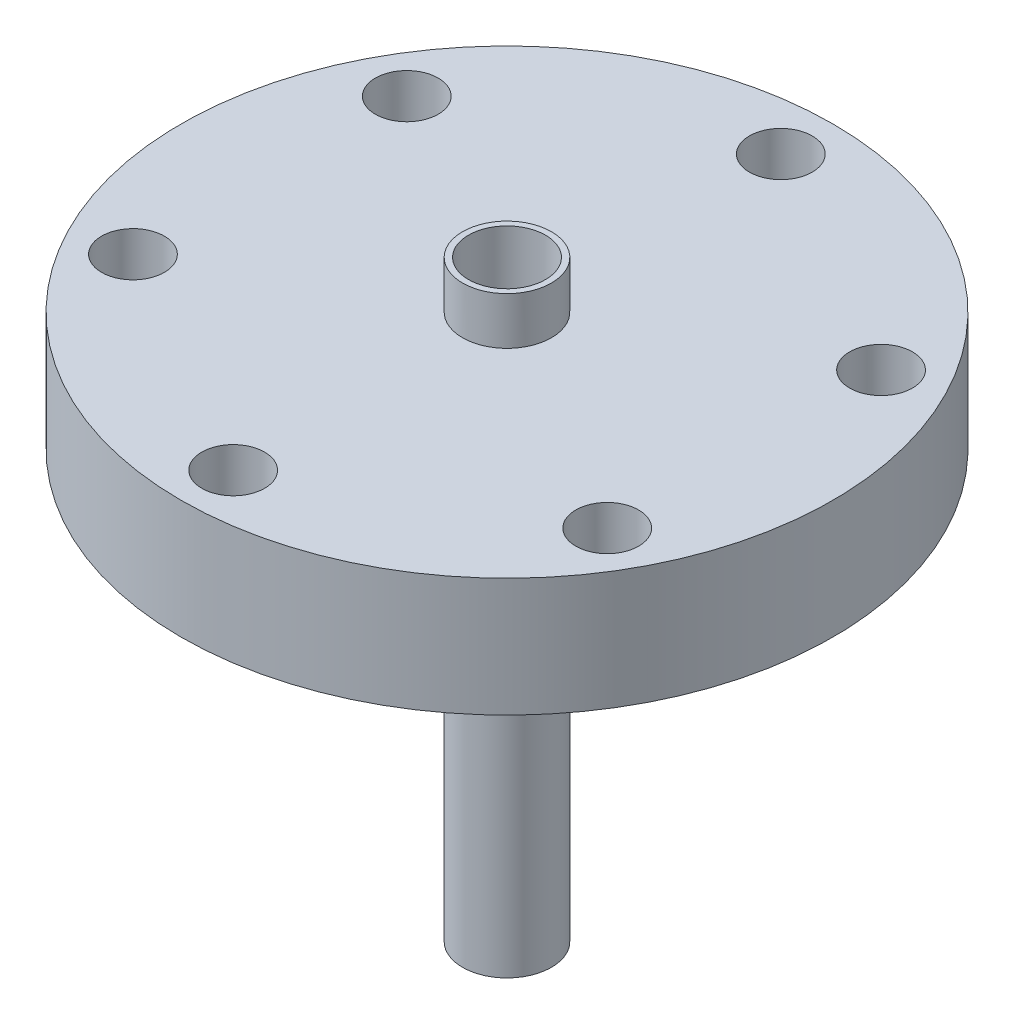
ISO-10303-21;
HEADER;
FILE_DESCRIPTION(('STEP AP214'),'2;1');
FILE_NAME('part.step','',(''),(''),'','','');
FILE_SCHEMA(('AUTOMOTIVE_DESIGN { 1 0 10303 214 1 1 1 1 }'));
ENDSEC;
DATA;
#1=APPLICATION_CONTEXT('core data for automotive mechanical design processes');
#2=APPLICATION_PROTOCOL_DEFINITION('international standard','automotive_design',2000,#1);
#3=PRODUCT_CONTEXT('',#1,'mechanical');
#4=PRODUCT('Part','Part','',(#3));
#5=PRODUCT_RELATED_PRODUCT_CATEGORY('part','',(#4));
#6=PRODUCT_DEFINITION_FORMATION('','',#4);
#7=PRODUCT_DEFINITION_CONTEXT('part definition',#1,'design');
#8=PRODUCT_DEFINITION('design','',#6,#7);
#9=PRODUCT_DEFINITION_SHAPE('','',#8);
#10=(LENGTH_UNIT() NAMED_UNIT(*) SI_UNIT(.MILLI.,.METRE.));
#11=(NAMED_UNIT(*) PLANE_ANGLE_UNIT() SI_UNIT($,.RADIAN.));
#12=(NAMED_UNIT(*) SI_UNIT($,.STERADIAN.) SOLID_ANGLE_UNIT());
#13=UNCERTAINTY_MEASURE_WITH_UNIT(LENGTH_MEASURE(1.E-05),#10,'distance_accuracy_value','');
#14=(GEOMETRIC_REPRESENTATION_CONTEXT(3) GLOBAL_UNCERTAINTY_ASSIGNED_CONTEXT((#13)) GLOBAL_UNIT_ASSIGNED_CONTEXT((#10,
#11,#12)) REPRESENTATION_CONTEXT('',''));
#15=CARTESIAN_POINT('',(0.,0.,0.));
#16=DIRECTION('',(0.,0.,1.));
#17=DIRECTION('',(1.,0.,0.));
#18=AXIS2_PLACEMENT_3D('',#15,#16,#17);
#19=CARTESIAN_POINT('',(0.,12.7,0.));
#20=DIRECTION('',(0.,1.,0.));
#21=DIRECTION('',(0.,0.,1.));
#22=AXIS2_PLACEMENT_3D('',#19,#20,#21);
#23=PLANE('',#22);
#24=CARTESIAN_POINT('',(25.4065872708242,12.7,14.6684999999998));
#25=DIRECTION('',(0.,1.,0.));
#26=DIRECTION('',(-0.866025403784443,0.,-0.499999999999992));
#27=AXIS2_PLACEMENT_3D('',#24,#25,#26);
#28=CIRCLE('',#27,3.3655);
#29=CARTESIAN_POINT('',(22.4919787743877,12.7,12.9857499999998));
#30=VERTEX_POINT('',#29);
#31=EDGE_CURVE('E77',#30,#30,#28,.T.);
#32=ORIENTED_EDGE('',*,*,#31,.F.);
#33=EDGE_LOOP('',(#32));
#34=FACE_BOUND('',#33,.T.);
#35=CARTESIAN_POINT('',(-25.406587270824,12.7,14.6685000000001));
#36=DIRECTION('',(0.,1.,0.));
#37=DIRECTION('',(0.866025403784436,0.,-0.500000000000004));
#38=AXIS2_PLACEMENT_3D('',#35,#36,#37);
#39=CIRCLE('',#38,3.3655);
#40=CARTESIAN_POINT('',(-22.4919787743875,12.7,12.9857500000001));
#41=VERTEX_POINT('',#40);
#42=EDGE_CURVE('E65',#41,#41,#39,.T.);
#43=ORIENTED_EDGE('',*,*,#42,.F.);
#44=EDGE_LOOP('',(#43));
#45=FACE_BOUND('',#44,.T.);
#46=CARTESIAN_POINT('',(0.,12.7,-29.337));
#47=DIRECTION('',(0.,1.,0.));
#48=DIRECTION('',(0.,0.,1.));
#49=AXIS2_PLACEMENT_3D('',#46,#47,#48);
#50=CIRCLE('',#49,3.3655);
#51=CARTESIAN_POINT('',(0.,12.7,-25.9715));
#52=VERTEX_POINT('',#51);
#53=EDGE_CURVE('E55',#52,#52,#50,.T.);
#54=ORIENTED_EDGE('',*,*,#53,.F.);
#55=EDGE_LOOP('',(#54));
#56=FACE_BOUND('',#55,.T.);
#57=CARTESIAN_POINT('',(0.,12.7,0.));
#58=DIRECTION('',(0.,1.,0.));
#59=DIRECTION('',(0.,0.,1.));
#60=AXIS2_PLACEMENT_3D('',#57,#58,#59);
#61=CIRCLE('',#60,34.925);
#62=CARTESIAN_POINT('',(0.,12.7,34.925));
#63=VERTEX_POINT('',#62);
#64=EDGE_CURVE('E11',#63,#63,#61,.T.);
#65=ORIENTED_EDGE('',*,*,#64,.T.);
#66=EDGE_LOOP('',(#65));
#67=FACE_BOUND('',#66,.T.);
#68=CARTESIAN_POINT('',(0.,12.7,0.));
#69=DIRECTION('',(0.,1.,0.));
#70=DIRECTION('',(0.,0.,1.));
#71=AXIS2_PLACEMENT_3D('',#68,#69,#70);
#72=CIRCLE('',#71,4.7625);
#73=CARTESIAN_POINT('',(0.,12.7,4.7625));
#74=VERTEX_POINT('',#73);
#75=EDGE_CURVE('E51',#74,#74,#72,.T.);
#76=ORIENTED_EDGE('',*,*,#75,.F.);
#77=EDGE_LOOP('',(#76));
#78=FACE_BOUND('',#77,.T.);
#79=CARTESIAN_POINT('',(-25.4065872708241,12.7,-14.6684999999999));
#80=DIRECTION('',(0.,1.,0.));
#81=DIRECTION('',(0.86602540378444,0.,0.499999999999998));
#82=AXIS2_PLACEMENT_3D('',#79,#80,#81);
#83=CIRCLE('',#82,3.3655);
#84=CARTESIAN_POINT('',(-22.4919787743876,12.7,-12.9857499999999));
#85=VERTEX_POINT('',#84);
#86=EDGE_CURVE('E59',#85,#85,#83,.T.);
#87=ORIENTED_EDGE('',*,*,#86,.F.);
#88=EDGE_LOOP('',(#87));
#89=FACE_BOUND('',#88,.T.);
#90=CARTESIAN_POINT('',(2.04859294729732E-13,12.7,29.337));
#91=DIRECTION('',(0.,1.,0.));
#92=DIRECTION('',(0.,0.,-1.));
#93=AXIS2_PLACEMENT_3D('',#90,#91,#92);
#94=CIRCLE('',#93,3.3655);
#95=CARTESIAN_POINT('',(1.81358120226105E-13,12.7,25.9715));
#96=VERTEX_POINT('',#95);
#97=EDGE_CURVE('E71',#96,#96,#94,.T.);
#98=ORIENTED_EDGE('',*,*,#97,.F.);
#99=EDGE_LOOP('',(#98));
#100=FACE_BOUND('',#99,.T.);
#101=CARTESIAN_POINT('',(25.4065872708239,12.7,-14.6685000000003));
#102=DIRECTION('',(0.,1.,0.));
#103=DIRECTION('',(-0.866025403784433,0.,0.50000000000001));
#104=AXIS2_PLACEMENT_3D('',#101,#102,#103);
#105=CIRCLE('',#104,3.3655);
#106=CARTESIAN_POINT('',(22.4919787743874,12.7,-12.9857500000003));
#107=VERTEX_POINT('',#106);
#108=EDGE_CURVE('E83',#107,#107,#105,.T.);
#109=ORIENTED_EDGE('',*,*,#108,.F.);
#110=EDGE_LOOP('',(#109));
#111=FACE_BOUND('',#110,.T.);
#112=ADVANCED_FACE('F40',(#34,#45,#56,#67,#78,#89,#100,#111),#23,.T.);
#113=CARTESIAN_POINT('',(0.,0.,0.));
#114=DIRECTION('',(0.,1.,0.));
#115=DIRECTION('',(0.,0.,1.));
#116=AXIS2_PLACEMENT_3D('',#113,#114,#115);
#117=PLANE('',#116);
#118=CARTESIAN_POINT('',(25.4065872708242,0.,14.6684999999998));
#119=DIRECTION('',(0.,1.,0.));
#120=DIRECTION('',(-0.866025403784443,0.,-0.499999999999992));
#121=AXIS2_PLACEMENT_3D('',#118,#119,#120);
#122=CIRCLE('',#121,3.3655);
#123=CARTESIAN_POINT('',(22.4919787743877,0.,12.9857499999998));
#124=VERTEX_POINT('',#123);
#125=EDGE_CURVE('E80',#124,#124,#122,.T.);
#126=ORIENTED_EDGE('',*,*,#125,.T.);
#127=EDGE_LOOP('',(#126));
#128=FACE_BOUND('',#127,.T.);
#129=CARTESIAN_POINT('',(-25.406587270824,0.,14.6685000000001));
#130=DIRECTION('',(0.,1.,0.));
#131=DIRECTION('',(0.866025403784436,0.,-0.500000000000004));
#132=AXIS2_PLACEMENT_3D('',#129,#130,#131);
#133=CIRCLE('',#132,3.3655);
#134=CARTESIAN_POINT('',(-22.4919787743875,0.,12.9857500000001));
#135=VERTEX_POINT('',#134);
#136=EDGE_CURVE('E68',#135,#135,#133,.T.);
#137=ORIENTED_EDGE('',*,*,#136,.T.);
#138=EDGE_LOOP('',(#137));
#139=FACE_BOUND('',#138,.T.);
#140=CARTESIAN_POINT('',(0.,0.,-29.337));
#141=DIRECTION('',(0.,1.,0.));
#142=DIRECTION('',(0.,0.,1.));
#143=AXIS2_PLACEMENT_3D('',#140,#141,#142);
#144=CIRCLE('',#143,3.3655);
#145=CARTESIAN_POINT('',(0.,0.,-25.9715));
#146=VERTEX_POINT('',#145);
#147=EDGE_CURVE('E56',#146,#146,#144,.T.);
#148=ORIENTED_EDGE('',*,*,#147,.T.);
#149=EDGE_LOOP('',(#148));
#150=FACE_BOUND('',#149,.T.);
#151=CARTESIAN_POINT('',(0.,0.,0.));
#152=DIRECTION('',(0.,1.,0.));
#153=DIRECTION('',(0.,0.,1.));
#154=AXIS2_PLACEMENT_3D('',#151,#152,#153);
#155=CIRCLE('',#154,34.925);
#156=CARTESIAN_POINT('',(0.,0.,34.925));
#157=VERTEX_POINT('',#156);
#158=EDGE_CURVE('E44',#157,#157,#155,.T.);
#159=ORIENTED_EDGE('',*,*,#158,.F.);
#160=EDGE_LOOP('',(#159));
#161=FACE_BOUND('',#160,.T.);
#162=CARTESIAN_POINT('',(0.,0.,0.));
#163=DIRECTION('',(0.,1.,0.));
#164=DIRECTION('',(0.,0.,1.));
#165=AXIS2_PLACEMENT_3D('',#162,#163,#164);
#166=CIRCLE('',#165,4.7625);
#167=CARTESIAN_POINT('',(0.,0.,4.7625));
#168=VERTEX_POINT('',#167);
#169=EDGE_CURVE('E89',#168,#168,#166,.T.);
#170=ORIENTED_EDGE('',*,*,#169,.T.);
#171=EDGE_LOOP('',(#170));
#172=FACE_BOUND('',#171,.T.);
#173=CARTESIAN_POINT('',(-25.4065872708241,0.,-14.6684999999999));
#174=DIRECTION('',(0.,1.,0.));
#175=DIRECTION('',(0.86602540378444,0.,0.499999999999998));
#176=AXIS2_PLACEMENT_3D('',#173,#174,#175);
#177=CIRCLE('',#176,3.3655);
#178=CARTESIAN_POINT('',(-22.4919787743876,0.,-12.9857499999999));
#179=VERTEX_POINT('',#178);
#180=EDGE_CURVE('E62',#179,#179,#177,.T.);
#181=ORIENTED_EDGE('',*,*,#180,.T.);
#182=EDGE_LOOP('',(#181));
#183=FACE_BOUND('',#182,.T.);
#184=CARTESIAN_POINT('',(2.04859294729732E-13,0.,29.337));
#185=DIRECTION('',(0.,1.,0.));
#186=DIRECTION('',(0.,0.,-1.));
#187=AXIS2_PLACEMENT_3D('',#184,#185,#186);
#188=CIRCLE('',#187,3.3655);
#189=CARTESIAN_POINT('',(1.81358120226105E-13,0.,25.9715));
#190=VERTEX_POINT('',#189);
#191=EDGE_CURVE('E74',#190,#190,#188,.T.);
#192=ORIENTED_EDGE('',*,*,#191,.T.);
#193=EDGE_LOOP('',(#192));
#194=FACE_BOUND('',#193,.T.);
#195=CARTESIAN_POINT('',(25.4065872708239,0.,-14.6685000000003));
#196=DIRECTION('',(0.,1.,0.));
#197=DIRECTION('',(-0.866025403784433,0.,0.50000000000001));
#198=AXIS2_PLACEMENT_3D('',#195,#196,#197);
#199=CIRCLE('',#198,3.3655);
#200=CARTESIAN_POINT('',(22.4919787743874,0.,-12.9857500000003));
#201=VERTEX_POINT('',#200);
#202=EDGE_CURVE('E86',#201,#201,#199,.T.);
#203=ORIENTED_EDGE('',*,*,#202,.T.);
#204=EDGE_LOOP('',(#203));
#205=FACE_BOUND('',#204,.T.);
#206=ADVANCED_FACE('F120',(#128,#139,#150,#161,#172,#183,#194,#205),#117,.F.);
#207=CARTESIAN_POINT('',(0.,12.7,0.));
#208=DIRECTION('',(0.,-1.,0.));
#209=DIRECTION('',(0.,0.,-1.));
#210=AXIS2_PLACEMENT_3D('',#207,#208,#209);
#211=CYLINDRICAL_SURFACE('',#210,34.925);
#212=ORIENTED_EDGE('',*,*,#64,.F.);
#213=EDGE_LOOP('',(#212));
#214=FACE_BOUND('',#213,.T.);
#215=ORIENTED_EDGE('',*,*,#158,.T.);
#216=EDGE_LOOP('',(#215));
#217=FACE_BOUND('',#216,.T.);
#218=ADVANCED_FACE('F42',(#214,#217),#211,.T.);
#219=CARTESIAN_POINT('',(0.,12.7,-29.337));
#220=DIRECTION('',(0.,-1.,0.));
#221=DIRECTION('',(0.,0.,-1.));
#222=AXIS2_PLACEMENT_3D('',#219,#220,#221);
#223=CYLINDRICAL_SURFACE('',#222,3.3655);
#224=ORIENTED_EDGE('',*,*,#53,.T.);
#225=EDGE_LOOP('',(#224));
#226=FACE_BOUND('',#225,.T.);
#227=ORIENTED_EDGE('',*,*,#147,.F.);
#228=EDGE_LOOP('',(#227));
#229=FACE_BOUND('',#228,.T.);
#230=ADVANCED_FACE('F130',(#226,#229),#223,.F.);
#231=CARTESIAN_POINT('',(-25.4065872708241,12.7,-14.6684999999999));
#232=DIRECTION('',(0.,-1.,0.));
#233=DIRECTION('',(0.,0.,-1.));
#234=AXIS2_PLACEMENT_3D('',#231,#232,#233);
#235=CYLINDRICAL_SURFACE('',#234,3.3655);
#236=ORIENTED_EDGE('',*,*,#86,.T.);
#237=EDGE_LOOP('',(#236));
#238=FACE_BOUND('',#237,.T.);
#239=ORIENTED_EDGE('',*,*,#180,.F.);
#240=EDGE_LOOP('',(#239));
#241=FACE_BOUND('',#240,.T.);
#242=ADVANCED_FACE('F133',(#238,#241),#235,.F.);
#243=CARTESIAN_POINT('',(-25.406587270824,12.7,14.6685000000001));
#244=DIRECTION('',(0.,-1.,0.));
#245=DIRECTION('',(0.,0.,-1.));
#246=AXIS2_PLACEMENT_3D('',#243,#244,#245);
#247=CYLINDRICAL_SURFACE('',#246,3.3655);
#248=ORIENTED_EDGE('',*,*,#42,.T.);
#249=EDGE_LOOP('',(#248));
#250=FACE_BOUND('',#249,.T.);
#251=ORIENTED_EDGE('',*,*,#136,.F.);
#252=EDGE_LOOP('',(#251));
#253=FACE_BOUND('',#252,.T.);
#254=ADVANCED_FACE('F137',(#250,#253),#247,.F.);
#255=CARTESIAN_POINT('',(2.04859294729732E-13,12.7,29.337));
#256=DIRECTION('',(0.,-1.,0.));
#257=DIRECTION('',(0.,0.,-1.));
#258=AXIS2_PLACEMENT_3D('',#255,#256,#257);
#259=CYLINDRICAL_SURFACE('',#258,3.3655);
#260=ORIENTED_EDGE('',*,*,#97,.T.);
#261=EDGE_LOOP('',(#260));
#262=FACE_BOUND('',#261,.T.);
#263=ORIENTED_EDGE('',*,*,#191,.F.);
#264=EDGE_LOOP('',(#263));
#265=FACE_BOUND('',#264,.T.);
#266=ADVANCED_FACE('F141',(#262,#265),#259,.F.);
#267=CARTESIAN_POINT('',(25.4065872708242,12.7,14.6684999999998));
#268=DIRECTION('',(0.,-1.,0.));
#269=DIRECTION('',(0.,0.,-1.));
#270=AXIS2_PLACEMENT_3D('',#267,#268,#269);
#271=CYLINDRICAL_SURFACE('',#270,3.3655);
#272=ORIENTED_EDGE('',*,*,#31,.T.);
#273=EDGE_LOOP('',(#272));
#274=FACE_BOUND('',#273,.T.);
#275=ORIENTED_EDGE('',*,*,#125,.F.);
#276=EDGE_LOOP('',(#275));
#277=FACE_BOUND('',#276,.T.);
#278=ADVANCED_FACE('F145',(#274,#277),#271,.F.);
#279=CARTESIAN_POINT('',(25.4065872708239,12.7,-14.6685000000003));
#280=DIRECTION('',(0.,-1.,0.));
#281=DIRECTION('',(0.,0.,-1.));
#282=AXIS2_PLACEMENT_3D('',#279,#280,#281);
#283=CYLINDRICAL_SURFACE('',#282,3.3655);
#284=ORIENTED_EDGE('',*,*,#108,.T.);
#285=EDGE_LOOP('',(#284));
#286=FACE_BOUND('',#285,.T.);
#287=ORIENTED_EDGE('',*,*,#202,.F.);
#288=EDGE_LOOP('',(#287));
#289=FACE_BOUND('',#288,.T.);
#290=ADVANCED_FACE('F149',(#286,#289),#283,.F.);
#291=CARTESIAN_POINT('',(0.,17.78,0.));
#292=DIRECTION('',(0.,-1.,0.));
#293=DIRECTION('',(0.,0.,-1.));
#294=AXIS2_PLACEMENT_3D('',#291,#292,#293);
#295=CYLINDRICAL_SURFACE('',#294,4.7625);
#296=CARTESIAN_POINT('',(0.,-45.72,0.));
#297=DIRECTION('',(0.,-1.,0.));
#298=DIRECTION('',(0.,0.,-1.));
#299=AXIS2_PLACEMENT_3D('',#296,#297,#298);
#300=CIRCLE('',#299,4.7625);
#301=CARTESIAN_POINT('',(0.,-45.72,-4.7625));
#302=VERTEX_POINT('',#301);
#303=EDGE_CURVE('E100',#302,#302,#300,.T.);
#304=ORIENTED_EDGE('',*,*,#303,.F.);
#305=EDGE_LOOP('',(#304));
#306=FACE_BOUND('',#305,.T.);
#307=ORIENTED_EDGE('',*,*,#169,.F.);
#308=EDGE_LOOP('',(#307));
#309=FACE_BOUND('',#308,.T.);
#310=ADVANCED_FACE('F153',(#306,#309),#295,.T.);
#311=ORIENTED_EDGE('',*,*,#75,.T.);
#312=EDGE_LOOP('',(#311));
#313=FACE_BOUND('',#312,.T.);
#314=CARTESIAN_POINT('',(0.,17.78,0.));
#315=DIRECTION('',(0.,-1.,0.));
#316=DIRECTION('',(0.,0.,-1.));
#317=AXIS2_PLACEMENT_3D('',#314,#315,#316);
#318=CIRCLE('',#317,4.7625);
#319=CARTESIAN_POINT('',(0.,17.78,-4.7625));
#320=VERTEX_POINT('',#319);
#321=EDGE_CURVE('E94',#320,#320,#318,.T.);
#322=ORIENTED_EDGE('',*,*,#321,.T.);
#323=EDGE_LOOP('',(#322));
#324=FACE_BOUND('',#323,.T.);
#325=ADVANCED_FACE('F155',(#313,#324),#295,.T.);
#326=CARTESIAN_POINT('',(0.,17.78,0.));
#327=DIRECTION('',(0.,-1.,0.));
#328=DIRECTION('',(0.,0.,-1.));
#329=AXIS2_PLACEMENT_3D('',#326,#327,#328);
#330=PLANE('',#329);
#331=CARTESIAN_POINT('',(0.,17.78,0.));
#332=DIRECTION('',(0.,-1.,0.));
#333=DIRECTION('',(1.,0.,0.));
#334=AXIS2_PLACEMENT_3D('',#331,#332,#333);
#335=CIRCLE('',#334,4.1275);
#336=CARTESIAN_POINT('',(4.1275,17.78,0.));
#337=VERTEX_POINT('',#336);
#338=EDGE_CURVE('E97',#337,#337,#335,.T.);
#339=ORIENTED_EDGE('',*,*,#338,.T.);
#340=EDGE_LOOP('',(#339));
#341=FACE_BOUND('',#340,.T.);
#342=ORIENTED_EDGE('',*,*,#321,.F.);
#343=EDGE_LOOP('',(#342));
#344=FACE_BOUND('',#343,.T.);
#345=ADVANCED_FACE('F116',(#341,#344),#330,.F.);
#346=CARTESIAN_POINT('',(0.,17.78,0.));
#347=DIRECTION('',(0.,-1.,0.));
#348=DIRECTION('',(0.,0.,-1.));
#349=AXIS2_PLACEMENT_3D('',#346,#347,#348);
#350=CYLINDRICAL_SURFACE('',#349,4.1275);
#351=ORIENTED_EDGE('',*,*,#338,.F.);
#352=EDGE_LOOP('',(#351));
#353=FACE_BOUND('',#352,.T.);
#354=CARTESIAN_POINT('',(0.,-45.72,0.));
#355=DIRECTION('',(0.,-1.,0.));
#356=DIRECTION('',(1.,0.,0.));
#357=AXIS2_PLACEMENT_3D('',#354,#355,#356);
#358=CIRCLE('',#357,4.1275);
#359=CARTESIAN_POINT('',(4.1275,-45.72,0.));
#360=VERTEX_POINT('',#359);
#361=EDGE_CURVE('E103',#360,#360,#358,.T.);
#362=ORIENTED_EDGE('',*,*,#361,.T.);
#363=EDGE_LOOP('',(#362));
#364=FACE_BOUND('',#363,.T.);
#365=ADVANCED_FACE('F107',(#353,#364),#350,.F.);
#366=CARTESIAN_POINT('',(0.,-45.72,0.));
#367=DIRECTION('',(0.,-1.,0.));
#368=DIRECTION('',(0.,0.,-1.));
#369=AXIS2_PLACEMENT_3D('',#366,#367,#368);
#370=PLANE('',#369);
#371=ORIENTED_EDGE('',*,*,#303,.T.);
#372=EDGE_LOOP('',(#371));
#373=FACE_BOUND('',#372,.T.);
#374=ORIENTED_EDGE('',*,*,#361,.F.);
#375=EDGE_LOOP('',(#374));
#376=FACE_BOUND('',#375,.T.);
#377=ADVANCED_FACE('F109',(#373,#376),#370,.T.);
#378=CLOSED_SHELL('',(#112,#206,#218,#230,#242,#254,#266,#278,#290,#310,#325,#345,#365,#377));
#379=MANIFOLD_SOLID_BREP('B2',#378);
#380=ADVANCED_BREP_SHAPE_REPRESENTATION('',(#18,#379),#14);
#381=SHAPE_DEFINITION_REPRESENTATION(#9,#380);
ENDSEC;
END-ISO-10303-21;
